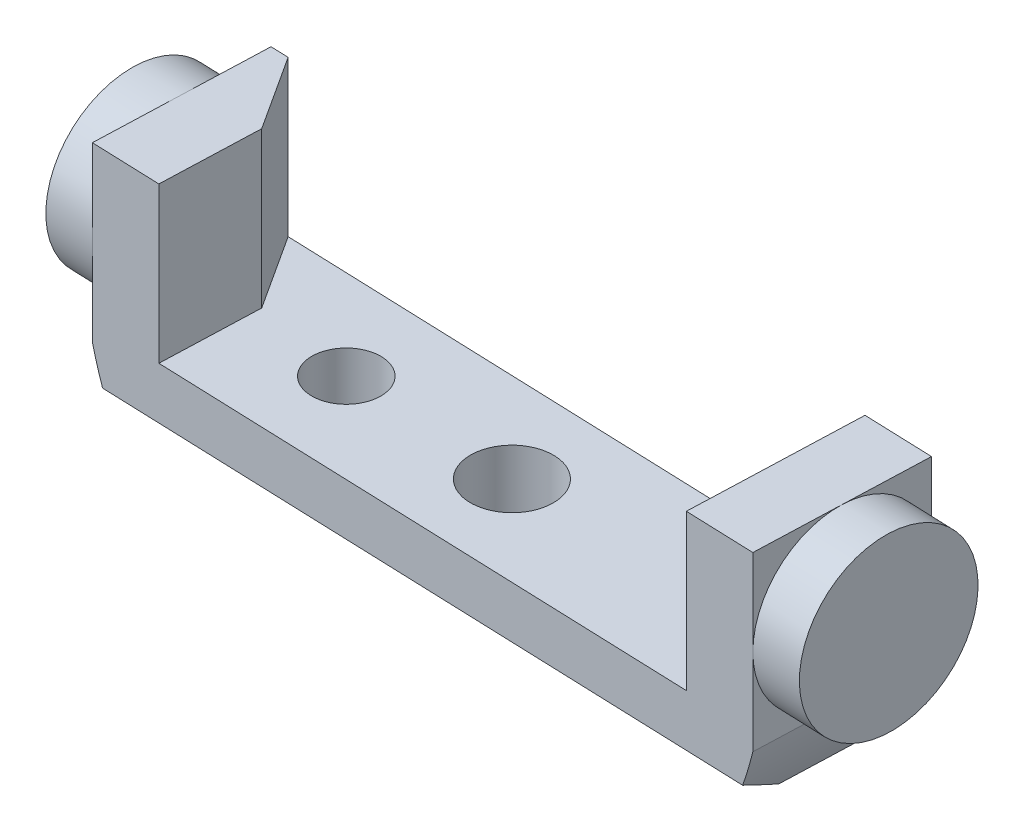
ISO-10303-21;
HEADER;
FILE_DESCRIPTION(('STEP AP214'),'2;1');
FILE_NAME('part.step','',(''),(''),'','','');
FILE_SCHEMA(('AUTOMOTIVE_DESIGN { 1 0 10303 214 1 1 1 1 }'));
ENDSEC;
DATA;
#1=APPLICATION_CONTEXT('core data for automotive mechanical design processes');
#2=APPLICATION_PROTOCOL_DEFINITION('international standard','automotive_design',2000,#1);
#3=PRODUCT_CONTEXT('',#1,'mechanical');
#4=PRODUCT('Part','Part','',(#3));
#5=PRODUCT_RELATED_PRODUCT_CATEGORY('part','',(#4));
#6=PRODUCT_DEFINITION_FORMATION('','',#4);
#7=PRODUCT_DEFINITION_CONTEXT('part definition',#1,'design');
#8=PRODUCT_DEFINITION('design','',#6,#7);
#9=PRODUCT_DEFINITION_SHAPE('','',#8);
#10=(LENGTH_UNIT() NAMED_UNIT(*) SI_UNIT(.MILLI.,.METRE.));
#11=(NAMED_UNIT(*) PLANE_ANGLE_UNIT() SI_UNIT($,.RADIAN.));
#12=(NAMED_UNIT(*) SI_UNIT($,.STERADIAN.) SOLID_ANGLE_UNIT());
#13=UNCERTAINTY_MEASURE_WITH_UNIT(LENGTH_MEASURE(1.E-05),#10,'distance_accuracy_value','');
#14=(GEOMETRIC_REPRESENTATION_CONTEXT(3) GLOBAL_UNCERTAINTY_ASSIGNED_CONTEXT((#13)) GLOBAL_UNIT_ASSIGNED_CONTEXT((#10,
#11,#12)) REPRESENTATION_CONTEXT('',''));
#15=CARTESIAN_POINT('',(0.,0.,0.));
#16=DIRECTION('',(0.,0.,1.));
#17=DIRECTION('',(1.,0.,0.));
#18=AXIS2_PLACEMENT_3D('',#15,#16,#17);
#19=CARTESIAN_POINT('',(-64.9099841946842,-0.875000014901161,-2.4983789053691));
#20=DIRECTION('',(-0.0360063221263097,0.,0.999351562147644));
#21=DIRECTION('',(0.,1.,0.));
#22=AXIS2_PLACEMENT_3D('',#19,#20,#21);
#23=PLANE('',#22);
#24=DIRECTION('',(0.,1.,0.));
#25=VECTOR('',#24,1.);
#26=CARTESIAN_POINT('',(-74.3226197697019,-0.312500007450576,-2.83751320145536));
#27=LINE('',#26,#25);
#28=CARTESIAN_POINT('',(-74.3226197697019,-2.,-2.83751320145536));
#29=VERTEX_POINT('',#28);
#30=CARTESIAN_POINT('',(-74.3226197697019,2.5,-2.83751320145536));
#31=VERTEX_POINT('',#30);
#32=EDGE_CURVE('E11',#29,#31,#27,.T.);
#33=ORIENTED_EDGE('',*,*,#32,.F.);
#34=DIRECTION('',(-0.999351562147644,0.,-0.0360063221263098));
#35=VECTOR('',#34,1.);
#36=CARTESIAN_POINT('',(-56.9822043757356,-2.00000002980233,-2.21274349464929));
#37=LINE('',#36,#35);
#38=CARTESIAN_POINT('',(-56.9822043757356,-2.00000002980233,-2.21274349464929));
#39=VERTEX_POINT('',#38);
#40=EDGE_CURVE('E24',#39,#29,#37,.T.);
#41=ORIENTED_EDGE('',*,*,#40,.F.);
#42=DIRECTION('',(0.,-1.,0.));
#43=VECTOR('',#42,1.);
#44=CARTESIAN_POINT('',(-56.9822043757356,2.5,-2.21274349464929));
#45=LINE('',#44,#43);
#46=CARTESIAN_POINT('',(-56.9822043757356,2.5,-2.21274349464929));
#47=VERTEX_POINT('',#46);
#48=EDGE_CURVE('E365',#47,#39,#45,.T.);
#49=ORIENTED_EDGE('',*,*,#48,.F.);
#50=DIRECTION('',(-0.999351562147644,0.,-0.0360063221263098));
#51=VECTOR('',#50,1.);
#52=CARTESIAN_POINT('',(-72.8377640136329,2.5,-2.78401431608891));
#53=LINE('',#52,#51);
#54=CARTESIAN_POINT('',(-54.9835012514403,2.5,-2.14073085039667));
#55=VERTEX_POINT('',#54);
#56=EDGE_CURVE('E360',#55,#47,#53,.T.);
#57=ORIENTED_EDGE('',*,*,#56,.F.);
#58=DIRECTION('',(0.,1.,0.));
#59=VECTOR('',#58,1.);
#60=CARTESIAN_POINT('',(-54.9835012514403,-2.5,-2.14073085039667));
#61=LINE('',#60,#59);
#62=CARTESIAN_POINT('',(-54.9835012514403,0.,-2.14073085039667));
#63=VERTEX_POINT('',#62);
#64=EDGE_CURVE('E355',#63,#55,#61,.T.);
#65=ORIENTED_EDGE('',*,*,#64,.F.);
#66=DIRECTION('',(0.,1.,0.));
#67=VECTOR('',#66,1.);
#68=CARTESIAN_POINT('',(-54.9835012514403,-2.5,-2.14073085039667));
#69=LINE('',#68,#67);
#70=CARTESIAN_POINT('',(-54.9835012514403,-2.5,-2.14073085039667));
#71=VERTEX_POINT('',#70);
#72=EDGE_CURVE('E350',#71,#63,#69,.T.);
#73=ORIENTED_EDGE('',*,*,#72,.F.);
#74=CARTESIAN_POINT('',(-64.9099841946842,0.,-2.4983789053691));
#75=DIRECTION('',(-0.0360063221263098,0.,0.999351562147644));
#76=DIRECTION('',(0.,1.,0.));
#77=AXIS2_PLACEMENT_3D('',#74,#75,#76);
#78=CIRCLE('',#77,10.2427035373352);
#79=CARTESIAN_POINT('',(-55.5966669689605,-4.25000002980233,-2.16282301813632));
#80=VERTEX_POINT('',#79);
#81=EDGE_CURVE('E345',#80,#71,#78,.T.);
#82=ORIENTED_EDGE('',*,*,#81,.F.);
#83=DIRECTION('',(0.999351562147644,0.,0.0360063221263098));
#84=VECTOR('',#83,1.);
#85=CARTESIAN_POINT('',(-74.2233014204079,-4.25000002980231,-2.83393479260188));
#86=LINE('',#85,#84);
#87=CARTESIAN_POINT('',(-74.2233014204079,-4.25000002980231,-2.83393479260188));
#88=VERTEX_POINT('',#87);
#89=EDGE_CURVE('E341',#88,#80,#86,.T.);
#90=ORIENTED_EDGE('',*,*,#89,.F.);
#91=CARTESIAN_POINT('',(-64.9099841946842,0.,-2.4983789053691));
#92=DIRECTION('',(-0.0360063221263098,0.,0.999351562147644));
#93=DIRECTION('',(0.,1.,0.));
#94=AXIS2_PLACEMENT_3D('',#91,#92,#93);
#95=CIRCLE('',#94,10.2427035373352);
#96=CARTESIAN_POINT('',(-74.8364671379282,-2.5,-2.85602696034153));
#97=VERTEX_POINT('',#96);
#98=EDGE_CURVE('E145',#97,#88,#95,.T.);
#99=ORIENTED_EDGE('',*,*,#98,.F.);
#100=DIRECTION('',(0.,-1.,0.));
#101=VECTOR('',#100,1.);
#102=CARTESIAN_POINT('',(-74.8364671379282,2.5,-2.85602696034153));
#103=LINE('',#102,#101);
#104=CARTESIAN_POINT('',(-74.8364671379282,0.,-2.85602696034153));
#105=VERTEX_POINT('',#104);
#106=EDGE_CURVE('E333',#105,#97,#103,.T.);
#107=ORIENTED_EDGE('',*,*,#106,.F.);
#108=DIRECTION('',(0.,-1.,0.));
#109=VECTOR('',#108,1.);
#110=CARTESIAN_POINT('',(-74.8364671379282,2.5,-2.85602696034153));
#111=LINE('',#110,#109);
#112=CARTESIAN_POINT('',(-74.8364671379282,2.5,-2.85602696034153));
#113=VERTEX_POINT('',#112);
#114=EDGE_CURVE('E328',#113,#105,#111,.T.);
#115=ORIENTED_EDGE('',*,*,#114,.F.);
#116=DIRECTION('',(-0.999351562147644,0.,-0.0360063221263098));
#117=VECTOR('',#116,1.);
#118=CARTESIAN_POINT('',(-74.8364671379282,2.5,-2.85602696034153));
#119=LINE('',#118,#117);
#120=EDGE_CURVE('E323',#31,#113,#119,.T.);
#121=ORIENTED_EDGE('',*,*,#120,.F.);
#122=EDGE_LOOP('',(#33,#41,#49,#57,#65,#73,#82,#90,#99,#107,#115,#121));
#123=FACE_BOUND('',#122,.T.);
#124=ADVANCED_FACE('F16',(#123),#23,.F.);
#125=CARTESIAN_POINT('',(-65.,0.,0.));
#126=DIRECTION('',(-0.0360063221263097,0.,0.999351562147644));
#127=DIRECTION('',(0.,1.,0.));
#128=AXIS2_PLACEMENT_3D('',#125,#126,#127);
#129=CYLINDRICAL_SURFACE('',#128,10.2427035373352);
#130=CARTESIAN_POINT('',(-65.308292534782,0.,8.55662583787545));
#131=DIRECTION('',(0.0180031610631553,0.866025403784439,-0.499675781073822));
#132=DIRECTION('',(-0.0311823896582297,0.5,0.865463840131523));
#133=AXIS2_PLACEMENT_3D('',#130,#131,#132);
#134=ELLIPSE('',#133,20.4854070746703,10.2427035373352);
#135=CARTESIAN_POINT('',(-55.4700967752217,-3.50000002980233,2.84498155907609));
#136=VERTEX_POINT('',#135);
#137=CARTESIAN_POINT('',(-55.7299249951047,-4.25000002980233,1.53573903240461));
#138=VERTEX_POINT('',#137);
#139=EDGE_CURVE('E319',#136,#138,#134,.T.);
#140=ORIENTED_EDGE('',*,*,#139,.T.);
#141=DIRECTION('',(-0.0360063221263098,0.,0.999351562147644));
#142=VECTOR('',#141,1.);
#143=CARTESIAN_POINT('',(-55.6866827742763,-4.25000002980233,0.335555887232787));
#144=LINE('',#143,#142);
#145=EDGE_CURVE('E132',#80,#138,#144,.T.);
#146=ORIENTED_EDGE('',*,*,#145,.F.);
#147=ORIENTED_EDGE('',*,*,#81,.T.);
#148=DIRECTION('',(0.0360063221263098,0.,-0.999351562147644));
#149=VECTOR('',#148,1.);
#150=CARTESIAN_POINT('',(-55.0735170567561,-2.5,0.357648054972434));
#151=LINE('',#150,#149);
#152=CARTESIAN_POINT('',(-55.0735170567561,-2.5,0.357648054972434));
#153=VERTEX_POINT('',#152);
#154=EDGE_CURVE('E311',#153,#71,#151,.T.);
#155=ORIENTED_EDGE('',*,*,#154,.F.);
#156=DIRECTION('',(0.0360063221263098,0.,-0.999351562147644));
#157=VECTOR('',#156,1.);
#158=CARTESIAN_POINT('',(-55.0735170567561,-2.5,0.357648054972434));
#159=LINE('',#158,#157);
#160=CARTESIAN_POINT('',(-55.1635328620719,-2.5,2.85602696034154));
#161=VERTEX_POINT('',#160);
#162=EDGE_CURVE('E306',#161,#153,#159,.T.);
#163=ORIENTED_EDGE('',*,*,#162,.F.);
#164=CARTESIAN_POINT('',(-65.0900158053158,0.,2.49837890536912));
#165=DIRECTION('',(0.0360063221263098,0.,-0.999351562147644));
#166=DIRECTION('',(0.,1.,0.));
#167=AXIS2_PLACEMENT_3D('',#164,#165,#166);
#168=CIRCLE('',#167,10.2427035373352);
#169=EDGE_CURVE('E304',#161,#136,#168,.T.);
#170=ORIENTED_EDGE('',*,*,#169,.T.);
#171=EDGE_LOOP('',(#140,#146,#147,#155,#163,#170));
#172=FACE_BOUND('',#171,.T.);
#173=ADVANCED_FACE('F405',(#172),#129,.T.);
#174=CARTESIAN_POINT('',(-72.9277798189486,2.5,-0.285635410719799));
#175=DIRECTION('',(0.,-1.,0.));
#176=DIRECTION('',(-0.999351562147644,0.,-0.0360063221263097));
#177=AXIS2_PLACEMENT_3D('',#174,#175,#176);
#178=PLANE('',#177);
#179=DIRECTION('',(0.0360063221263098,0.,-0.999351562147644));
#180=VECTOR('',#179,1.);
#181=CARTESIAN_POINT('',(-57.0722201810514,2.5,0.285635410719814));
#182=LINE('',#181,#180);
#183=CARTESIAN_POINT('',(-57.1622359863671,2.5,2.78401431608892));
#184=VERTEX_POINT('',#183);
#185=EDGE_CURVE('E301',#184,#47,#182,.T.);
#186=ORIENTED_EDGE('',*,*,#185,.F.);
#187=DIRECTION('',(0.999351562147644,0.,0.0360063221263098));
#188=VECTOR('',#187,1.);
#189=CARTESIAN_POINT('',(-73.0177956242644,2.5,2.21274349464931));
#190=LINE('',#189,#188);
#191=CARTESIAN_POINT('',(-55.1635328620719,2.5,2.85602696034154));
#192=VERTEX_POINT('',#191);
#193=EDGE_CURVE('E299',#184,#192,#190,.T.);
#194=ORIENTED_EDGE('',*,*,#193,.T.);
#195=DIRECTION('',(0.0360063221263098,0.,-0.999351562147644));
#196=VECTOR('',#195,1.);
#197=CARTESIAN_POINT('',(-55.0735170567561,2.5,0.357648054972434));
#198=LINE('',#197,#196);
#199=CARTESIAN_POINT('',(-55.0735170567561,2.5,0.357648054972434));
#200=VERTEX_POINT('',#199);
#201=EDGE_CURVE('E298',#192,#200,#198,.T.);
#202=ORIENTED_EDGE('',*,*,#201,.T.);
#203=EDGE_CURVE('E293',#200,#55,#198,.T.);
#204=ORIENTED_EDGE('',*,*,#203,.T.);
#205=ORIENTED_EDGE('',*,*,#56,.T.);
#206=EDGE_LOOP('',(#186,#194,#202,#204,#205));
#207=FACE_BOUND('',#206,.T.);
#208=ADVANCED_FACE('F425',(#207),#178,.F.);
#209=CARTESIAN_POINT('',(-57.0722201810514,2.5,0.285635410719814));
#210=DIRECTION('',(0.999351562147644,0.,0.0360063221263097));
#211=DIRECTION('',(0.,-1.,0.));
#212=AXIS2_PLACEMENT_3D('',#209,#210,#211);
#213=PLANE('',#212);
#214=DIRECTION('',(0.0360063221263098,0.,-0.999351562147644));
#215=VECTOR('',#214,1.);
#216=CARTESIAN_POINT('',(-57.0722201810514,-2.00000002980233,0.285635410719814));
#217=LINE('',#216,#215);
#218=CARTESIAN_POINT('',(-57.1622359863671,-2.00000002980233,2.78401431608892));
#219=VERTEX_POINT('',#218);
#220=EDGE_CURVE('E288',#219,#39,#217,.T.);
#221=ORIENTED_EDGE('',*,*,#220,.F.);
#222=DIRECTION('',(0.,1.,0.));
#223=VECTOR('',#222,1.);
#224=CARTESIAN_POINT('',(-57.1622359863671,2.5,2.78401431608892));
#225=LINE('',#224,#223);
#226=EDGE_CURVE('E285',#219,#184,#225,.T.);
#227=ORIENTED_EDGE('',*,*,#226,.T.);
#228=ORIENTED_EDGE('',*,*,#185,.T.);
#229=ORIENTED_EDGE('',*,*,#48,.T.);
#230=EDGE_LOOP('',(#221,#227,#228,#229));
#231=FACE_BOUND('',#230,.T.);
#232=ADVANCED_FACE('F429',(#231),#213,.F.);
#233=CARTESIAN_POINT('',(-57.0722201810514,-2.00000002980233,0.285635410719814));
#234=DIRECTION('',(0.,-1.,0.));
#235=DIRECTION('',(-0.999351562147644,0.,-0.0360063221263097));
#236=AXIS2_PLACEMENT_3D('',#233,#234,#235);
#237=PLANE('',#236);
#238=CARTESIAN_POINT('',(-69.9792893429387,-2.00000002980232,-0.179402227236882));
#239=DIRECTION('',(0.,1.,0.));
#240=DIRECTION('',(-0.0360063221263098,0.,0.999351562147644));
#241=AXIS2_PLACEMENT_3D('',#238,#239,#240);
#242=CIRCLE('',#241,1.);
#243=CARTESIAN_POINT('',(-70.015295665065,-2.00000002980232,0.819949334910762));
#244=VERTEX_POINT('',#243);
#245=EDGE_CURVE('E282',#244,#244,#242,.T.);
#246=ORIENTED_EDGE('',*,*,#245,.F.);
#247=EDGE_LOOP('',(#246));
#248=FACE_BOUND('',#247,.T.);
#249=CARTESIAN_POINT('',(-65.,-2.00000002980232,0.));
#250=DIRECTION('',(0.,1.,0.));
#251=DIRECTION('',(0.0360063221263098,0.,-0.999351562147644));
#252=AXIS2_PLACEMENT_3D('',#249,#250,#251);
#253=CIRCLE('',#252,1.2);
#254=CARTESIAN_POINT('',(-64.9567924134484,-2.00000002980232,-1.19922187457716));
#255=VERTEX_POINT('',#254);
#256=EDGE_CURVE('E277',#255,#255,#253,.T.);
#257=ORIENTED_EDGE('',*,*,#256,.F.);
#258=EDGE_LOOP('',(#257));
#259=FACE_BOUND('',#258,.T.);
#260=DIRECTION('',(0.0360063221263098,0.,-0.999351562147644));
#261=VECTOR('',#260,1.);
#262=CARTESIAN_POINT('',(-72.9277798189486,-2.00000002980232,-0.285635410719799));
#263=LINE('',#262,#261);
#264=CARTESIAN_POINT('',(-73.0177956242644,-2.00000002980232,2.21274349464931));
#265=VERTEX_POINT('',#264);
#266=CARTESIAN_POINT('',(-72.9141683401319,-2.,-0.663420527759424));
#267=VERTEX_POINT('',#266);
#268=EDGE_CURVE('E272',#265,#267,#263,.T.);
#269=ORIENTED_EDGE('',*,*,#268,.F.);
#270=DIRECTION('',(0.999351562147644,0.,0.0360063221263098));
#271=VECTOR('',#270,1.);
#272=CARTESIAN_POINT('',(-57.1622359863671,-2.00000002980233,2.78401431608892));
#273=LINE('',#272,#271);
#274=EDGE_CURVE('E267',#265,#219,#273,.T.);
#275=ORIENTED_EDGE('',*,*,#274,.T.);
#276=ORIENTED_EDGE('',*,*,#220,.T.);
#277=ORIENTED_EDGE('',*,*,#40,.T.);
#278=DIRECTION('',(0.543709855301402,0.,0.839273253027957));
#279=VECTOR('',#278,1.);
#280=CARTESIAN_POINT('',(-76.219366375214,-2.,-5.76534075185998));
#281=LINE('',#280,#279);
#282=EDGE_CURVE('E263',#29,#267,#281,.T.);
#283=ORIENTED_EDGE('',*,*,#282,.T.);
#284=EDGE_LOOP('',(#269,#275,#276,#277,#283));
#285=FACE_BOUND('',#284,.T.);
#286=ADVANCED_FACE('F373',(#248,#259,#285),#237,.F.);
#287=CARTESIAN_POINT('',(-65.0900158053158,-0.875000014901161,2.49837890536912));
#288=DIRECTION('',(-0.0360063221263097,0.,0.999351562147644));
#289=DIRECTION('',(0.,1.,0.));
#290=AXIS2_PLACEMENT_3D('',#287,#288,#289);
#291=PLANE('',#290);
#292=DIRECTION('',(0.999351562147644,0.,0.0360063221263098));
#293=VECTOR('',#292,1.);
#294=CARTESIAN_POINT('',(-69.7466744181776,-3.50000002980232,2.33060096175273));
#295=LINE('',#294,#293);
#296=CARTESIAN_POINT('',(-74.7099348354098,-3.50000002980232,2.15177625166214));
#297=VERTEX_POINT('',#296);
#298=EDGE_CURVE('E149',#297,#136,#295,.T.);
#299=ORIENTED_EDGE('',*,*,#298,.T.);
#300=ORIENTED_EDGE('',*,*,#169,.F.);
#301=DIRECTION('',(0.,-1.,0.));
#302=VECTOR('',#301,1.);
#303=CARTESIAN_POINT('',(-55.1635328620719,-2.5,2.85602696034154));
#304=LINE('',#303,#302);
#305=CARTESIAN_POINT('',(-55.1635328620719,0.,2.85602696034154));
#306=VERTEX_POINT('',#305);
#307=EDGE_CURVE('E255',#306,#161,#304,.T.);
#308=ORIENTED_EDGE('',*,*,#307,.F.);
#309=DIRECTION('',(0.,-1.,0.));
#310=VECTOR('',#309,1.);
#311=CARTESIAN_POINT('',(-55.1635328620719,-2.5,2.85602696034154));
#312=LINE('',#311,#310);
#313=EDGE_CURVE('E250',#192,#306,#312,.T.);
#314=ORIENTED_EDGE('',*,*,#313,.F.);
#315=ORIENTED_EDGE('',*,*,#193,.F.);
#316=ORIENTED_EDGE('',*,*,#226,.F.);
#317=ORIENTED_EDGE('',*,*,#274,.F.);
#318=DIRECTION('',(0.,-1.,0.));
#319=VECTOR('',#318,1.);
#320=CARTESIAN_POINT('',(-73.0177956242644,2.5,2.21274349464931));
#321=LINE('',#320,#319);
#322=CARTESIAN_POINT('',(-73.0177956242644,2.5,2.21274349464931));
#323=VERTEX_POINT('',#322);
#324=EDGE_CURVE('E245',#323,#265,#321,.T.);
#325=ORIENTED_EDGE('',*,*,#324,.F.);
#326=DIRECTION('',(0.999351562147644,0.,0.0360063221263098));
#327=VECTOR('',#326,1.);
#328=CARTESIAN_POINT('',(-75.0164987485597,2.5,2.14073085039669));
#329=LINE('',#328,#327);
#330=CARTESIAN_POINT('',(-75.0164987485597,2.5,2.14073085039669));
#331=VERTEX_POINT('',#330);
#332=EDGE_CURVE('E240',#331,#323,#329,.T.);
#333=ORIENTED_EDGE('',*,*,#332,.F.);
#334=DIRECTION('',(0.,1.,0.));
#335=VECTOR('',#334,1.);
#336=CARTESIAN_POINT('',(-75.0164987485597,2.5,2.14073085039669));
#337=LINE('',#336,#335);
#338=CARTESIAN_POINT('',(-75.0164987485597,0.,2.14073085039669));
#339=VERTEX_POINT('',#338);
#340=EDGE_CURVE('E235',#339,#331,#337,.T.);
#341=ORIENTED_EDGE('',*,*,#340,.F.);
#342=DIRECTION('',(0.,1.,0.));
#343=VECTOR('',#342,1.);
#344=CARTESIAN_POINT('',(-75.0164987485597,2.5,2.14073085039669));
#345=LINE('',#344,#343);
#346=CARTESIAN_POINT('',(-75.0164987485597,-2.5,2.14073085039669));
#347=VERTEX_POINT('',#346);
#348=EDGE_CURVE('E230',#347,#339,#345,.T.);
#349=ORIENTED_EDGE('',*,*,#348,.F.);
#350=CARTESIAN_POINT('',(-65.0900158053158,0.,2.49837890536912));
#351=DIRECTION('',(0.0360063221263098,0.,-0.999351562147644));
#352=DIRECTION('',(0.,1.,0.));
#353=AXIS2_PLACEMENT_3D('',#350,#351,#352);
#354=CIRCLE('',#353,10.2427035373352);
#355=EDGE_CURVE('E228',#297,#347,#354,.T.);
#356=ORIENTED_EDGE('',*,*,#355,.F.);
#357=EDGE_LOOP('',(#299,#300,#308,#314,#315,#316,#317,#325,#333,#341,#349,#356));
#358=FACE_BOUND('',#357,.T.);
#359=ADVANCED_FACE('F385',(#358),#291,.T.);
#360=CARTESIAN_POINT('',(-74.9264829432439,2.5,-0.357648054972417));
#361=DIRECTION('',(0.999351562147644,0.,0.0360063221263097));
#362=DIRECTION('',(0.,-1.,0.));
#363=AXIS2_PLACEMENT_3D('',#360,#361,#362);
#364=PLANE('',#363);
#365=CARTESIAN_POINT('',(-74.9264829432439,0.,-0.357648054972417));
#366=DIRECTION('',(-0.999351562147644,0.,-0.0360063221263098));
#367=DIRECTION('',(0.0360063221263098,0.,-0.999351562147644));
#368=AXIS2_PLACEMENT_3D('',#365,#366,#367);
#369=CIRCLE('',#368,2.5);
#370=CARTESIAN_POINT('',(-74.9264829432439,2.5,-0.357648054972417));
#371=VERTEX_POINT('',#370);
#372=EDGE_CURVE('E223',#339,#371,#369,.T.);
#373=ORIENTED_EDGE('',*,*,#372,.F.);
#374=ORIENTED_EDGE('',*,*,#340,.T.);
#375=DIRECTION('',(0.0360063221263098,0.,-0.999351562147644));
#376=VECTOR('',#375,1.);
#377=CARTESIAN_POINT('',(-74.9264829432439,2.5,-0.357648054972417));
#378=LINE('',#377,#376);
#379=EDGE_CURVE('E221',#331,#371,#378,.T.);
#380=ORIENTED_EDGE('',*,*,#379,.T.);
#381=EDGE_LOOP('',(#373,#374,#380));
#382=FACE_BOUND('',#381,.T.);
#383=ADVANCED_FACE('F389',(#382),#364,.F.);
#384=CARTESIAN_POINT('',(-74.9264829432439,-2.5,-0.357648054972417));
#385=VERTEX_POINT('',#384);
#386=EDGE_CURVE('E218',#385,#339,#369,.T.);
#387=ORIENTED_EDGE('',*,*,#386,.F.);
#388=DIRECTION('',(0.0360063221263098,0.,-0.999351562147644));
#389=VECTOR('',#388,1.);
#390=CARTESIAN_POINT('',(-74.9264829432439,-2.5,-0.357648054972417));
#391=LINE('',#390,#389);
#392=EDGE_CURVE('E215',#347,#385,#391,.T.);
#393=ORIENTED_EDGE('',*,*,#392,.F.);
#394=ORIENTED_EDGE('',*,*,#348,.T.);
#395=EDGE_LOOP('',(#387,#393,#394));
#396=FACE_BOUND('',#395,.T.);
#397=ADVANCED_FACE('F396',(#396),#364,.F.);
#398=EDGE_CURVE('E212',#105,#385,#369,.T.);
#399=ORIENTED_EDGE('',*,*,#398,.F.);
#400=ORIENTED_EDGE('',*,*,#106,.T.);
#401=DIRECTION('',(0.0360063221263098,0.,-0.999351562147644));
#402=VECTOR('',#401,1.);
#403=CARTESIAN_POINT('',(-74.9264829432439,-2.5,-0.357648054972417));
#404=LINE('',#403,#402);
#405=EDGE_CURVE('E210',#385,#97,#404,.T.);
#406=ORIENTED_EDGE('',*,*,#405,.F.);
#407=EDGE_LOOP('',(#399,#400,#406));
#408=FACE_BOUND('',#407,.T.);
#409=ADVANCED_FACE('F430',(#408),#364,.F.);
#410=EDGE_CURVE('E207',#371,#105,#369,.T.);
#411=ORIENTED_EDGE('',*,*,#410,.F.);
#412=DIRECTION('',(0.0360063221263098,0.,-0.999351562147644));
#413=VECTOR('',#412,1.);
#414=CARTESIAN_POINT('',(-74.9264829432439,2.5,-0.357648054972417));
#415=LINE('',#414,#413);
#416=EDGE_CURVE('E204',#371,#113,#415,.T.);
#417=ORIENTED_EDGE('',*,*,#416,.T.);
#418=ORIENTED_EDGE('',*,*,#114,.T.);
#419=EDGE_LOOP('',(#411,#417,#418));
#420=FACE_BOUND('',#419,.T.);
#421=ADVANCED_FACE('F432',(#420),#364,.F.);
#422=CARTESIAN_POINT('',(-76.3255751302507,0.,-0.408056905949253));
#423=DIRECTION('',(0.999351562147644,0.,0.0360063221263097));
#424=DIRECTION('',(0.,-1.,0.));
#425=AXIS2_PLACEMENT_3D('',#422,#423,#424);
#426=PLANE('',#425);
#427=CARTESIAN_POINT('',(-76.3255751302507,0.,-0.408056905949253));
#428=DIRECTION('',(0.999351562147644,0.,0.0360063221263098));
#429=DIRECTION('',(0.0360063221263098,0.,-0.999351562147644));
#430=AXIS2_PLACEMENT_3D('',#427,#428,#429);
#431=CIRCLE('',#430,2.5);
#432=CARTESIAN_POINT('',(-76.2355593249349,0.,-2.90643581131836));
#433=VERTEX_POINT('',#432);
#434=EDGE_CURVE('E199',#433,#433,#431,.T.);
#435=ORIENTED_EDGE('',*,*,#434,.F.);
#436=EDGE_LOOP('',(#435));
#437=FACE_BOUND('',#436,.T.);
#438=ADVANCED_FACE('F439',(#437),#426,.F.);
#439=CARTESIAN_POINT('',(-55.0735170567561,0.,0.357648054972434));
#440=DIRECTION('',(-0.999351562147644,0.,-0.0360063221263097));
#441=DIRECTION('',(0.,1.,0.));
#442=AXIS2_PLACEMENT_3D('',#439,#440,#441);
#443=CYLINDRICAL_SURFACE('',#442,2.5);
#444=ORIENTED_EDGE('',*,*,#372,.T.);
#445=ORIENTED_EDGE('',*,*,#410,.T.);
#446=ORIENTED_EDGE('',*,*,#398,.T.);
#447=ORIENTED_EDGE('',*,*,#386,.T.);
#448=EDGE_LOOP('',(#444,#445,#446,#447));
#449=FACE_BOUND('',#448,.T.);
#450=ORIENTED_EDGE('',*,*,#434,.T.);
#451=EDGE_LOOP('',(#450));
#452=FACE_BOUND('',#451,.T.);
#453=ADVANCED_FACE('F399',(#449,#452),#443,.T.);
#454=CARTESIAN_POINT('',(-55.0735170567561,-2.5,0.357648054972434));
#455=DIRECTION('',(-0.999351562147644,0.,-0.0360063221263097));
#456=DIRECTION('',(0.,1.,0.));
#457=AXIS2_PLACEMENT_3D('',#454,#455,#456);
#458=PLANE('',#457);
#459=CARTESIAN_POINT('',(-55.0735170567561,0.,0.357648054972434));
#460=DIRECTION('',(0.999351562147644,0.,0.0360063221263098));
#461=DIRECTION('',(0.,1.,0.));
#462=AXIS2_PLACEMENT_3D('',#459,#460,#461);
#463=CIRCLE('',#462,2.5);
#464=EDGE_CURVE('E194',#306,#153,#463,.T.);
#465=ORIENTED_EDGE('',*,*,#464,.F.);
#466=ORIENTED_EDGE('',*,*,#307,.T.);
#467=ORIENTED_EDGE('',*,*,#162,.T.);
#468=EDGE_LOOP('',(#465,#466,#467));
#469=FACE_BOUND('',#468,.T.);
#470=ADVANCED_FACE('F409',(#469),#458,.F.);
#471=CARTESIAN_POINT('',(-55.0735170567561,0.,0.357648054972434));
#472=DIRECTION('',(0.999351562147644,0.,0.0360063221263098));
#473=DIRECTION('',(0.,1.,0.));
#474=AXIS2_PLACEMENT_3D('',#471,#472,#473);
#475=CIRCLE('',#474,2.5);
#476=EDGE_CURVE('E189',#200,#306,#475,.T.);
#477=ORIENTED_EDGE('',*,*,#476,.F.);
#478=ORIENTED_EDGE('',*,*,#201,.F.);
#479=ORIENTED_EDGE('',*,*,#313,.T.);
#480=EDGE_LOOP('',(#477,#478,#479));
#481=FACE_BOUND('',#480,.T.);
#482=ADVANCED_FACE('F420',(#481),#458,.F.);
#483=CARTESIAN_POINT('',(-55.0735170567561,0.,0.357648054972434));
#484=DIRECTION('',(0.999351562147644,0.,0.0360063221263098));
#485=DIRECTION('',(0.,1.,0.));
#486=AXIS2_PLACEMENT_3D('',#483,#484,#485);
#487=CIRCLE('',#486,2.5);
#488=EDGE_CURVE('E184',#63,#200,#487,.T.);
#489=ORIENTED_EDGE('',*,*,#488,.F.);
#490=ORIENTED_EDGE('',*,*,#64,.T.);
#491=ORIENTED_EDGE('',*,*,#203,.F.);
#492=EDGE_LOOP('',(#489,#490,#491));
#493=FACE_BOUND('',#492,.T.);
#494=ADVANCED_FACE('F423',(#493),#458,.F.);
#495=CARTESIAN_POINT('',(-55.0735170567561,0.,0.357648054972434));
#496=DIRECTION('',(0.999351562147644,0.,0.0360063221263098));
#497=DIRECTION('',(0.,1.,0.));
#498=AXIS2_PLACEMENT_3D('',#495,#496,#497);
#499=CIRCLE('',#498,2.5);
#500=EDGE_CURVE('E181',#153,#63,#499,.T.);
#501=ORIENTED_EDGE('',*,*,#500,.F.);
#502=ORIENTED_EDGE('',*,*,#154,.T.);
#503=ORIENTED_EDGE('',*,*,#72,.T.);
#504=EDGE_LOOP('',(#501,#502,#503));
#505=FACE_BOUND('',#504,.T.);
#506=ADVANCED_FACE('F411',(#505),#458,.F.);
#507=CARTESIAN_POINT('',(-53.6744248697493,0.,0.408056905949269));
#508=DIRECTION('',(-0.999351562147644,0.,-0.0360063221263097));
#509=DIRECTION('',(0.,1.,0.));
#510=AXIS2_PLACEMENT_3D('',#507,#508,#509);
#511=PLANE('',#510);
#512=CARTESIAN_POINT('',(-53.6744248697493,0.,0.408056905949269));
#513=DIRECTION('',(-0.999351562147644,0.,-0.0360063221263098));
#514=DIRECTION('',(0.,1.,0.));
#515=AXIS2_PLACEMENT_3D('',#512,#513,#514);
#516=CIRCLE('',#515,2.5);
#517=CARTESIAN_POINT('',(-53.6744248697493,2.49999999999999,0.408056905949269));
#518=VERTEX_POINT('',#517);
#519=EDGE_CURVE('E178',#518,#518,#516,.T.);
#520=ORIENTED_EDGE('',*,*,#519,.F.);
#521=EDGE_LOOP('',(#520));
#522=FACE_BOUND('',#521,.T.);
#523=ADVANCED_FACE('F477',(#522),#511,.F.);
#524=ORIENTED_EDGE('',*,*,#464,.T.);
#525=ORIENTED_EDGE('',*,*,#500,.T.);
#526=ORIENTED_EDGE('',*,*,#488,.T.);
#527=ORIENTED_EDGE('',*,*,#476,.T.);
#528=EDGE_LOOP('',(#524,#525,#526,#527));
#529=FACE_BOUND('',#528,.T.);
#530=ORIENTED_EDGE('',*,*,#519,.T.);
#531=EDGE_LOOP('',(#530));
#532=FACE_BOUND('',#531,.T.);
#533=ADVANCED_FACE('F413',(#529,#532),#443,.T.);
#534=CARTESIAN_POINT('',(-69.9792893429387,-2.00000002980232,-0.179402227236882));
#535=DIRECTION('',(0.,1.,0.));
#536=DIRECTION('',(-0.0360063221263098,0.,0.999351562147644));
#537=AXIS2_PLACEMENT_3D('',#534,#535,#536);
#538=CYLINDRICAL_SURFACE('',#537,1.);
#539=CARTESIAN_POINT('',(-69.9792893429387,-4.25000002980232,-0.179402227236882));
#540=DIRECTION('',(0.,-1.,0.));
#541=DIRECTION('',(-0.0360063221263098,0.,0.999351562147644));
#542=AXIS2_PLACEMENT_3D('',#539,#540,#541);
#543=CIRCLE('',#542,1.);
#544=CARTESIAN_POINT('',(-70.015295665065,-4.25000002980232,0.819949334910762));
#545=VERTEX_POINT('',#544);
#546=EDGE_CURVE('E173',#545,#545,#543,.T.);
#547=ORIENTED_EDGE('',*,*,#546,.T.);
#548=EDGE_LOOP('',(#547));
#549=FACE_BOUND('',#548,.T.);
#550=ORIENTED_EDGE('',*,*,#245,.T.);
#551=EDGE_LOOP('',(#550));
#552=FACE_BOUND('',#551,.T.);
#553=ADVANCED_FACE('F473',(#549,#552),#538,.F.);
#554=CARTESIAN_POINT('',(-72.9277798189486,-2.00000002980232,-0.285635410719799));
#555=DIRECTION('',(-0.999351562147644,0.,-0.0360063221263097));
#556=DIRECTION('',(0.,1.,0.));
#557=AXIS2_PLACEMENT_3D('',#554,#555,#556);
#558=PLANE('',#557);
#559=DIRECTION('',(0.,-1.,0.));
#560=VECTOR('',#559,1.);
#561=CARTESIAN_POINT('',(-72.9141683401319,-0.875000014901157,-0.663420527759422));
#562=LINE('',#561,#560);
#563=CARTESIAN_POINT('',(-72.9141683401319,2.5,-0.663420527759424));
#564=VERTEX_POINT('',#563);
#565=EDGE_CURVE('E168',#564,#267,#562,.T.);
#566=ORIENTED_EDGE('',*,*,#565,.F.);
#567=DIRECTION('',(0.0360063221263098,0.,-0.999351562147644));
#568=VECTOR('',#567,1.);
#569=CARTESIAN_POINT('',(-72.9277798189486,2.5,-0.285635410719799));
#570=LINE('',#569,#568);
#571=EDGE_CURVE('E163',#323,#564,#570,.T.);
#572=ORIENTED_EDGE('',*,*,#571,.F.);
#573=ORIENTED_EDGE('',*,*,#324,.T.);
#574=ORIENTED_EDGE('',*,*,#268,.T.);
#575=EDGE_LOOP('',(#566,#572,#573,#574));
#576=FACE_BOUND('',#575,.T.);
#577=ADVANCED_FACE('F379',(#576),#558,.F.);
#578=DIRECTION('',(0.543709855301402,0.,0.839273253027957));
#579=VECTOR('',#578,1.);
#580=CARTESIAN_POINT('',(-73.5342103029238,2.5,-1.62052040382792));
#581=LINE('',#580,#579);
#582=EDGE_CURVE('E160',#31,#564,#581,.T.);
#583=ORIENTED_EDGE('',*,*,#582,.F.);
#584=ORIENTED_EDGE('',*,*,#120,.T.);
#585=ORIENTED_EDGE('',*,*,#416,.F.);
#586=ORIENTED_EDGE('',*,*,#379,.F.);
#587=ORIENTED_EDGE('',*,*,#332,.T.);
#588=ORIENTED_EDGE('',*,*,#571,.T.);
#589=EDGE_LOOP('',(#583,#584,#585,#586,#587,#588));
#590=FACE_BOUND('',#589,.T.);
#591=ADVANCED_FACE('F381',(#590),#178,.F.);
#592=CARTESIAN_POINT('',(-74.3226197697019,0.250000000000005,-2.83751320145536));
#593=DIRECTION('',(0.839273253027957,0.,-0.543709855301402));
#594=DIRECTION('',(0.543709855301402,0.,0.839273253027957));
#595=AXIS2_PLACEMENT_3D('',#592,#593,#594);
#596=PLANE('',#595);
#597=ORIENTED_EDGE('',*,*,#565,.T.);
#598=ORIENTED_EDGE('',*,*,#282,.F.);
#599=ORIENTED_EDGE('',*,*,#32,.T.);
#600=ORIENTED_EDGE('',*,*,#582,.T.);
#601=EDGE_LOOP('',(#597,#598,#599,#600));
#602=FACE_BOUND('',#601,.T.);
#603=ADVANCED_FACE('F375',(#602),#596,.T.);
#604=CARTESIAN_POINT('',(-65.,-5.59999994039536,0.));
#605=DIRECTION('',(0.,-1.,0.));
#606=DIRECTION('',(0.0360063221263098,0.,-0.999351562147644));
#607=AXIS2_PLACEMENT_3D('',#604,#605,#606);
#608=CYLINDRICAL_SURFACE('',#607,1.2);
#609=ORIENTED_EDGE('',*,*,#256,.T.);
#610=EDGE_LOOP('',(#609));
#611=FACE_BOUND('',#610,.T.);
#612=CARTESIAN_POINT('',(-65.,-4.25000002980232,0.));
#613=DIRECTION('',(0.,-1.,0.));
#614=DIRECTION('',(0.0360063221263098,0.,-0.999351562147644));
#615=AXIS2_PLACEMENT_3D('',#612,#613,#614);
#616=CIRCLE('',#615,1.2);
#617=CARTESIAN_POINT('',(-64.9567924134484,-4.25000002980232,-1.19922187457716));
#618=VERTEX_POINT('',#617);
#619=EDGE_CURVE('E136',#618,#618,#616,.T.);
#620=ORIENTED_EDGE('',*,*,#619,.T.);
#621=EDGE_LOOP('',(#620));
#622=FACE_BOUND('',#621,.T.);
#623=ADVANCED_FACE('F457',(#611,#622),#608,.F.);
#624=CARTESIAN_POINT('',(-74.3133172257237,-4.25000002980231,-0.335555887232771));
#625=DIRECTION('',(0.,1.,0.));
#626=DIRECTION('',(0.999351562147644,0.,0.0360063221263097));
#627=AXIS2_PLACEMENT_3D('',#624,#625,#626);
#628=PLANE('',#627);
#629=ORIENTED_EDGE('',*,*,#619,.F.);
#630=EDGE_LOOP('',(#629));
#631=FACE_BOUND('',#630,.T.);
#632=ORIENTED_EDGE('',*,*,#546,.F.);
#633=EDGE_LOOP('',(#632));
#634=FACE_BOUND('',#633,.T.);
#635=DIRECTION('',(-0.999351562147644,0.,-0.0360063221263098));
#636=VECTOR('',#635,1.);
#637=CARTESIAN_POINT('',(-69.6999008336903,-4.25000002980232,1.03240520155544));
#638=LINE('',#637,#636);
#639=CARTESIAN_POINT('',(-74.3565594465522,-4.25000002980231,0.864627257939052));
#640=VERTEX_POINT('',#639);
#641=EDGE_CURVE('E125',#138,#640,#638,.T.);
#642=ORIENTED_EDGE('',*,*,#641,.T.);
#643=DIRECTION('',(0.0360063221263098,0.,-0.999351562147644));
#644=VECTOR('',#643,1.);
#645=CARTESIAN_POINT('',(-74.3133172257237,-4.25000002980231,-0.335555887232771));
#646=LINE('',#645,#644);
#647=EDGE_CURVE('E129',#640,#88,#646,.T.);
#648=ORIENTED_EDGE('',*,*,#647,.T.);
#649=ORIENTED_EDGE('',*,*,#89,.T.);
#650=ORIENTED_EDGE('',*,*,#145,.T.);
#651=EDGE_LOOP('',(#642,#648,#649,#650));
#652=FACE_BOUND('',#651,.T.);
#653=ADVANCED_FACE('F127',(#631,#634,#652),#628,.F.);
#654=CARTESIAN_POINT('',(-65.308292534782,0.,8.55662583787545));
#655=DIRECTION('',(0.0180031610631553,0.866025403784439,-0.499675781073822));
#656=DIRECTION('',(-0.0311823896582297,0.5,0.865463840131523));
#657=AXIS2_PLACEMENT_3D('',#654,#655,#656);
#658=ELLIPSE('',#657,20.4854070746703,10.2427035373352);
#659=EDGE_CURVE('E142',#640,#297,#658,.T.);
#660=ORIENTED_EDGE('',*,*,#659,.T.);
#661=ORIENTED_EDGE('',*,*,#355,.T.);
#662=ORIENTED_EDGE('',*,*,#392,.T.);
#663=ORIENTED_EDGE('',*,*,#405,.T.);
#664=ORIENTED_EDGE('',*,*,#98,.T.);
#665=ORIENTED_EDGE('',*,*,#647,.F.);
#666=EDGE_LOOP('',(#660,#661,#662,#663,#664,#665));
#667=FACE_BOUND('',#666,.T.);
#668=ADVANCED_FACE('F140',(#667),#129,.T.);
#669=CARTESIAN_POINT('',(-69.723287625934,-3.87500002980232,1.68150308165409));
#670=DIRECTION('',(0.0180031610631553,0.866025403784439,-0.499675781073822));
#671=DIRECTION('',(0.0311823896582297,-0.5,-0.865463840131523));
#672=AXIS2_PLACEMENT_3D('',#669,#670,#671);
#673=PLANE('',#672);
#674=ORIENTED_EDGE('',*,*,#659,.F.);
#675=ORIENTED_EDGE('',*,*,#641,.F.);
#676=ORIENTED_EDGE('',*,*,#139,.F.);
#677=ORIENTED_EDGE('',*,*,#298,.F.);
#678=EDGE_LOOP('',(#674,#675,#676,#677));
#679=FACE_BOUND('',#678,.T.);
#680=ADVANCED_FACE('F147',(#679),#673,.F.);
#681=CLOSED_SHELL('',(#124,#173,#208,#232,#286,#359,#383,#397,#409,#421,#438,#453,#470,#482,
#494,#506,#523,#533,#553,#577,#591,#603,#623,#653,#668,#680));
#682=MANIFOLD_SOLID_BREP('B1',#681);
#683=ADVANCED_BREP_SHAPE_REPRESENTATION('',(#18,#682),#14);
#684=SHAPE_DEFINITION_REPRESENTATION(#9,#683);
ENDSEC;
END-ISO-10303-21;
